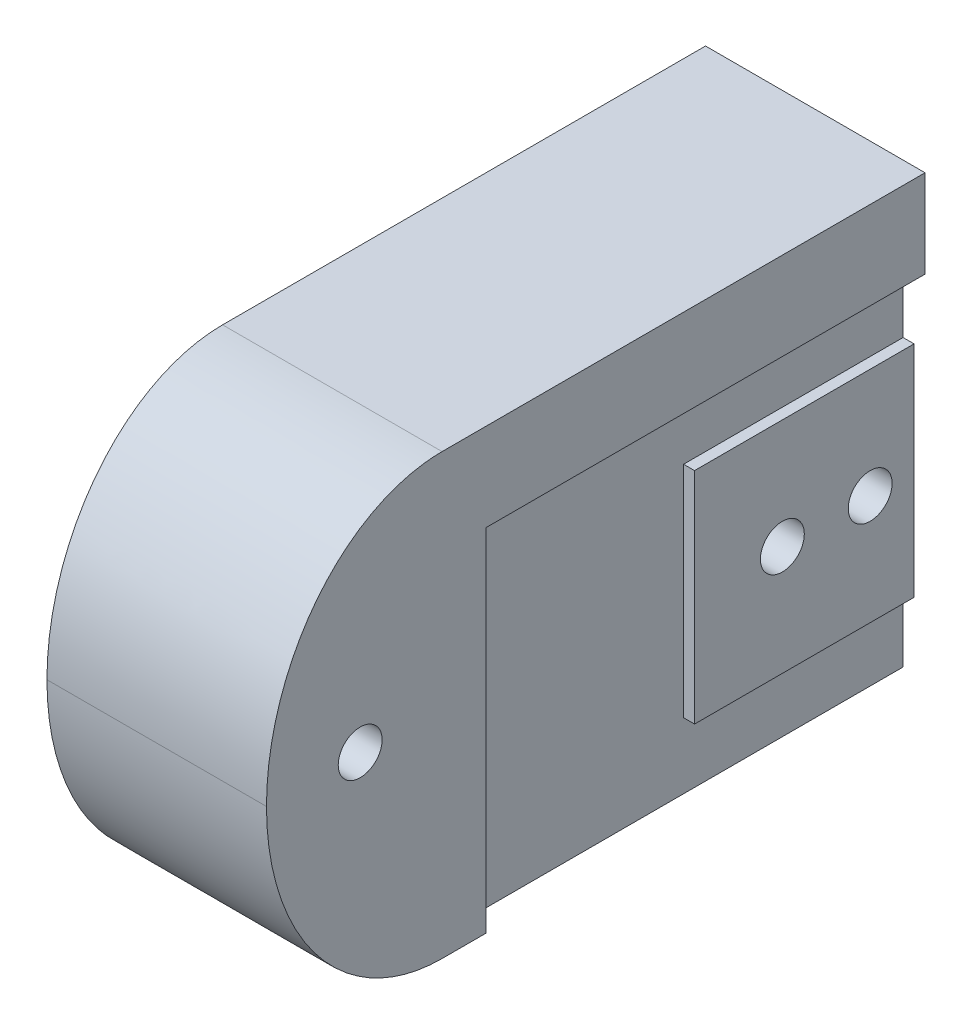
ISO-10303-21;
HEADER;
FILE_DESCRIPTION(('STEP AP214'),'2;1');
FILE_NAME('part.step','',(''),(''),'','','');
FILE_SCHEMA(('AUTOMOTIVE_DESIGN { 1 0 10303 214 1 1 1 1 }'));
ENDSEC;
DATA;
#1=APPLICATION_CONTEXT('core data for automotive mechanical design processes');
#2=APPLICATION_PROTOCOL_DEFINITION('international standard','automotive_design',2000,#1);
#3=PRODUCT_CONTEXT('',#1,'mechanical');
#4=PRODUCT('Part','Part','',(#3));
#5=PRODUCT_RELATED_PRODUCT_CATEGORY('part','',(#4));
#6=PRODUCT_DEFINITION_FORMATION('','',#4);
#7=PRODUCT_DEFINITION_CONTEXT('part definition',#1,'design');
#8=PRODUCT_DEFINITION('design','',#6,#7);
#9=PRODUCT_DEFINITION_SHAPE('','',#8);
#10=(LENGTH_UNIT() NAMED_UNIT(*) SI_UNIT(.MILLI.,.METRE.));
#11=(NAMED_UNIT(*) PLANE_ANGLE_UNIT() SI_UNIT($,.RADIAN.));
#12=(NAMED_UNIT(*) SI_UNIT($,.STERADIAN.) SOLID_ANGLE_UNIT());
#13=UNCERTAINTY_MEASURE_WITH_UNIT(LENGTH_MEASURE(1.E-05),#10,'distance_accuracy_value','');
#14=(GEOMETRIC_REPRESENTATION_CONTEXT(3) GLOBAL_UNCERTAINTY_ASSIGNED_CONTEXT((#13)) GLOBAL_UNIT_ASSIGNED_CONTEXT((#10,
#11,#12)) REPRESENTATION_CONTEXT('',''));
#15=CARTESIAN_POINT('',(0.,0.,0.));
#16=DIRECTION('',(0.,0.,1.));
#17=DIRECTION('',(1.,0.,0.));
#18=AXIS2_PLACEMENT_3D('',#15,#16,#17);
#19=CARTESIAN_POINT('',(45.,0.,0.));
#20=DIRECTION('',(1.,0.,0.));
#21=DIRECTION('',(0.,0.,-1.));
#22=AXIS2_PLACEMENT_3D('',#19,#20,#21);
#23=PLANE('',#22);
#24=DIRECTION('',(0.,-1.,0.));
#25=VECTOR('',#24,1.);
#26=CARTESIAN_POINT('',(45.,5.53697183098588,6.95422535211272));
#27=LINE('',#26,#25);
#28=CARTESIAN_POINT('',(45.,5.53697183098588,6.95422535211272));
#29=VERTEX_POINT('',#28);
#30=CARTESIAN_POINT('',(45.,-44.4630281690141,6.95422535211272));
#31=VERTEX_POINT('',#30);
#32=EDGE_CURVE('E387',#29,#31,#27,.T.);
#33=ORIENTED_EDGE('',*,*,#32,.F.);
#34=DIRECTION('',(0.,0.,1.));
#35=VECTOR('',#34,1.);
#36=CARTESIAN_POINT('',(45.,5.53697183098589,-43.0457746478873));
#37=LINE('',#36,#35);
#38=CARTESIAN_POINT('',(45.,5.53697183098589,-43.0457746478873));
#39=VERTEX_POINT('',#38);
#40=EDGE_CURVE('E390',#39,#29,#37,.T.);
#41=ORIENTED_EDGE('',*,*,#40,.F.);
#42=DIRECTION('',(0.,1.,0.));
#43=VECTOR('',#42,1.);
#44=CARTESIAN_POINT('',(45.,-59.4630281690141,-43.0457746478873));
#45=LINE('',#44,#43);
#46=CARTESIAN_POINT('',(45.,20.5369718309859,-43.0457746478873));
#47=VERTEX_POINT('',#46);
#48=EDGE_CURVE('E161',#39,#47,#45,.T.);
#49=ORIENTED_EDGE('',*,*,#48,.T.);
#50=DIRECTION('',(0.,0.,1.));
#51=VECTOR('',#50,1.);
#52=CARTESIAN_POINT('',(45.,20.5369718309859,-43.0457746478873));
#53=LINE('',#52,#51);
#54=CARTESIAN_POINT('',(45.,20.5369718309859,56.9542253521127));
#55=VERTEX_POINT('',#54);
#56=EDGE_CURVE('E174',#47,#55,#53,.T.);
#57=ORIENTED_EDGE('',*,*,#56,.T.);
#58=DIRECTION('',(0.,-1.,0.));
#59=VECTOR('',#58,1.);
#60=CARTESIAN_POINT('',(45.,-59.4630281690141,56.9542253521127));
#61=LINE('',#60,#59);
#62=CARTESIAN_POINT('',(45.,-59.4630281690141,56.9542253521127));
#63=VERTEX_POINT('',#62);
#64=EDGE_CURVE('E177',#55,#63,#61,.T.);
#65=ORIENTED_EDGE('',*,*,#64,.T.);
#66=DIRECTION('',(0.,0.,-1.));
#67=VECTOR('',#66,1.);
#68=CARTESIAN_POINT('',(45.,-59.4630281690141,-43.0457746478873));
#69=LINE('',#68,#67);
#70=CARTESIAN_POINT('',(45.,-59.4630281690141,-43.0457746478873));
#71=VERTEX_POINT('',#70);
#72=EDGE_CURVE('E180',#63,#71,#69,.T.);
#73=ORIENTED_EDGE('',*,*,#72,.T.);
#74=CARTESIAN_POINT('',(45.,-44.4630281690141,-43.0457746478873));
#75=VERTEX_POINT('',#74);
#76=EDGE_CURVE('E171',#71,#75,#45,.T.);
#77=ORIENTED_EDGE('',*,*,#76,.T.);
#78=DIRECTION('',(0.,0.,-1.));
#79=VECTOR('',#78,1.);
#80=CARTESIAN_POINT('',(45.,-44.4630281690141,-43.0457746478873));
#81=LINE('',#80,#79);
#82=EDGE_CURVE('E155',#31,#75,#81,.T.);
#83=ORIENTED_EDGE('',*,*,#82,.F.);
#84=EDGE_LOOP('',(#33,#41,#49,#57,#65,#73,#77,#83));
#85=FACE_BOUND('',#84,.T.);
#86=ADVANCED_FACE('F39',(#85),#23,.T.);
#87=CARTESIAN_POINT('',(50.,-59.4630281690141,106.954225352113));
#88=DIRECTION('',(0.,1.,0.));
#89=DIRECTION('',(0.,0.,1.));
#90=AXIS2_PLACEMENT_3D('',#87,#88,#89);
#91=PLANE('',#90);
#92=DIRECTION('',(0.,0.,-1.));
#93=VECTOR('',#92,1.);
#94=CARTESIAN_POINT('',(50.,-59.4630281690141,106.954225352113));
#95=LINE('',#94,#93);
#96=CARTESIAN_POINT('',(50.,-59.4630281690141,66.9542253521127));
#97=VERTEX_POINT('',#96);
#98=CARTESIAN_POINT('',(50.,-59.4630281690141,56.9542253521127));
#99=VERTEX_POINT('',#98);
#100=EDGE_CURVE('E197',#97,#99,#95,.T.);
#101=ORIENTED_EDGE('',*,*,#100,.F.);
#102=CARTESIAN_POINT('',(-2.5,-59.4630281690141,66.9542253521127));
#103=CARTESIAN_POINT('',(15.8333333333333,-59.4630281690141,66.9542253521127));
#104=CARTESIAN_POINT('',(34.1666666666667,-59.4630281690141,66.9542253521127));
#105=CARTESIAN_POINT('',(52.5,-59.4630281690141,66.9542253521127));
#106=(BOUNDED_CURVE() B_SPLINE_CURVE(3,(#102,#103,#104,#105),.UNSPECIFIED.,.F.,
.F.) B_SPLINE_CURVE_WITH_KNOTS((4,4),(-0.0025,0.0525),
.UNSPECIFIED.) CURVE() GEOMETRIC_REPRESENTATION_ITEM() RATIONAL_B_SPLINE_CURVE((1.,1.,1.,1.)) REPRESENTATION_ITEM(''));
#107=CARTESIAN_POINT('',(0.,-59.4630281690141,66.9542253521127));
#108=VERTEX_POINT('',#107);
#109=EDGE_CURVE('E367',#97,#108,#106,.F.);
#110=ORIENTED_EDGE('',*,*,#109,.T.);
#111=DIRECTION('',(0.,0.,-1.));
#112=VECTOR('',#111,1.);
#113=CARTESIAN_POINT('',(0.,-59.4630281690141,106.954225352113));
#114=LINE('',#113,#112);
#115=CARTESIAN_POINT('',(0.,-59.4630281690141,-43.0457746478873));
#116=VERTEX_POINT('',#115);
#117=EDGE_CURVE('E188',#108,#116,#114,.T.);
#118=ORIENTED_EDGE('',*,*,#117,.T.);
#119=DIRECTION('',(-1.,0.,0.));
#120=VECTOR('',#119,1.);
#121=CARTESIAN_POINT('',(50.,-59.4630281690141,-43.0457746478873));
#122=LINE('',#121,#120);
#123=EDGE_CURVE('E201',#71,#116,#122,.T.);
#124=ORIENTED_EDGE('',*,*,#123,.F.);
#125=ORIENTED_EDGE('',*,*,#72,.F.);
#126=DIRECTION('',(1.,0.,0.));
#127=VECTOR('',#126,1.);
#128=CARTESIAN_POINT('',(45.,-59.4630281690141,56.9542253521127));
#129=LINE('',#128,#127);
#130=EDGE_CURVE('E185',#63,#99,#129,.T.);
#131=ORIENTED_EDGE('',*,*,#130,.T.);
#132=EDGE_LOOP('',(#101,#110,#118,#124,#125,#131));
#133=FACE_BOUND('',#132,.T.);
#134=ADVANCED_FACE('F308',(#133),#91,.F.);
#135=CARTESIAN_POINT('',(50.,40.5369718309859,-43.0457746478873));
#136=DIRECTION('',(0.,0.,1.));
#137=DIRECTION('',(0.,-1.,0.));
#138=AXIS2_PLACEMENT_3D('',#135,#136,#137);
#139=PLANE('',#138);
#140=DIRECTION('',(0.,1.,0.));
#141=VECTOR('',#140,1.);
#142=CARTESIAN_POINT('',(50.,40.5369718309859,-43.0457746478873));
#143=LINE('',#142,#141);
#144=CARTESIAN_POINT('',(50.,20.5369718309859,-43.0457746478873));
#145=VERTEX_POINT('',#144);
#146=CARTESIAN_POINT('',(50.,40.5369718309859,-43.0457746478873));
#147=VERTEX_POINT('',#146);
#148=EDGE_CURVE('E194',#145,#147,#143,.T.);
#149=ORIENTED_EDGE('',*,*,#148,.F.);
#150=DIRECTION('',(1.,0.,0.));
#151=VECTOR('',#150,1.);
#152=CARTESIAN_POINT('',(45.,20.5369718309859,-43.0457746478873));
#153=LINE('',#152,#151);
#154=EDGE_CURVE('E181',#47,#145,#153,.T.);
#155=ORIENTED_EDGE('',*,*,#154,.F.);
#156=ORIENTED_EDGE('',*,*,#48,.F.);
#157=DIRECTION('',(-1.,0.,0.));
#158=VECTOR('',#157,1.);
#159=CARTESIAN_POINT('',(47.5,5.53697183098589,-43.0457746478873));
#160=LINE('',#159,#158);
#161=CARTESIAN_POINT('',(47.5,5.53697183098589,-43.0457746478873));
#162=VERTEX_POINT('',#161);
#163=EDGE_CURVE('E139',#162,#39,#160,.T.);
#164=ORIENTED_EDGE('',*,*,#163,.F.);
#165=DIRECTION('',(0.,1.,0.));
#166=VECTOR('',#165,1.);
#167=CARTESIAN_POINT('',(47.5,5.53697183098589,-43.0457746478873));
#168=LINE('',#167,#166);
#169=CARTESIAN_POINT('',(47.5,-44.4630281690141,-43.0457746478873));
#170=VERTEX_POINT('',#169);
#171=EDGE_CURVE('E146',#170,#162,#168,.T.);
#172=ORIENTED_EDGE('',*,*,#171,.F.);
#173=DIRECTION('',(-1.,0.,0.));
#174=VECTOR('',#173,1.);
#175=CARTESIAN_POINT('',(47.5,-44.4630281690141,-43.0457746478873));
#176=LINE('',#175,#174);
#177=EDGE_CURVE('E381',#170,#75,#176,.T.);
#178=ORIENTED_EDGE('',*,*,#177,.T.);
#179=ORIENTED_EDGE('',*,*,#76,.F.);
#180=ORIENTED_EDGE('',*,*,#123,.T.);
#181=DIRECTION('',(0.,1.,0.));
#182=VECTOR('',#181,1.);
#183=CARTESIAN_POINT('',(0.,40.5369718309859,-43.0457746478873));
#184=LINE('',#183,#182);
#185=CARTESIAN_POINT('',(0.,40.5369718309859,-43.0457746478873));
#186=VERTEX_POINT('',#185);
#187=EDGE_CURVE('E205',#116,#186,#184,.T.);
#188=ORIENTED_EDGE('',*,*,#187,.T.);
#189=DIRECTION('',(-1.,0.,0.));
#190=VECTOR('',#189,1.);
#191=CARTESIAN_POINT('',(50.,40.5369718309859,-43.0457746478873));
#192=LINE('',#191,#190);
#193=EDGE_CURVE('E213',#147,#186,#192,.T.);
#194=ORIENTED_EDGE('',*,*,#193,.F.);
#195=EDGE_LOOP('',(#149,#155,#156,#164,#172,#178,#179,#180,#188,#194));
#196=FACE_BOUND('',#195,.T.);
#197=ADVANCED_FACE('F159',(#196),#139,.F.);
#198=CARTESIAN_POINT('',(50.,40.5369718309859,106.954225352113));
#199=DIRECTION('',(0.,-1.,0.));
#200=DIRECTION('',(0.,0.,-1.));
#201=AXIS2_PLACEMENT_3D('',#198,#199,#200);
#202=PLANE('',#201);
#203=DIRECTION('',(0.,0.,1.));
#204=VECTOR('',#203,1.);
#205=CARTESIAN_POINT('',(0.,40.5369718309859,106.954225352113));
#206=LINE('',#205,#204);
#207=CARTESIAN_POINT('',(0.,40.5369718309859,66.9542253521127));
#208=VERTEX_POINT('',#207);
#209=EDGE_CURVE('E200',#186,#208,#206,.T.);
#210=ORIENTED_EDGE('',*,*,#209,.T.);
#211=CARTESIAN_POINT('',(52.5,40.5369718309859,66.9542253521127));
#212=CARTESIAN_POINT('',(34.1666666666667,40.5369718309859,66.9542253521127));
#213=CARTESIAN_POINT('',(15.8333333333333,40.5369718309859,66.9542253521127));
#214=CARTESIAN_POINT('',(-2.5,40.5369718309859,66.9542253521127));
#215=(BOUNDED_CURVE() B_SPLINE_CURVE(3,(#211,#212,#213,#214),.UNSPECIFIED.,.F.,
.F.) B_SPLINE_CURVE_WITH_KNOTS((4,4),(-0.0025,0.0525),
.UNSPECIFIED.) CURVE() GEOMETRIC_REPRESENTATION_ITEM() RATIONAL_B_SPLINE_CURVE((1.,1.,1.,1.)) REPRESENTATION_ITEM(''));
#216=CARTESIAN_POINT('',(50.,40.5369718309859,66.9542253521127));
#217=VERTEX_POINT('',#216);
#218=EDGE_CURVE('E12',#208,#217,#215,.F.);
#219=ORIENTED_EDGE('',*,*,#218,.T.);
#220=DIRECTION('',(0.,0.,1.));
#221=VECTOR('',#220,1.);
#222=CARTESIAN_POINT('',(50.,40.5369718309859,106.954225352113));
#223=LINE('',#222,#221);
#224=EDGE_CURVE('E251',#147,#217,#223,.T.);
#225=ORIENTED_EDGE('',*,*,#224,.F.);
#226=ORIENTED_EDGE('',*,*,#193,.T.);
#227=EDGE_LOOP('',(#210,#219,#225,#226));
#228=FACE_BOUND('',#227,.T.);
#229=ADVANCED_FACE('F244',(#228),#202,.F.);
#230=CARTESIAN_POINT('',(50.,0.,0.));
#231=DIRECTION('',(1.,0.,0.));
#232=DIRECTION('',(0.,0.,-1.));
#233=AXIS2_PLACEMENT_3D('',#230,#231,#232);
#234=PLANE('',#233);
#235=CARTESIAN_POINT('',(50.,-9.4630281690141,85.6147511313994));
#236=DIRECTION('',(1.,0.,0.));
#237=DIRECTION('',(0.,0.,-1.));
#238=AXIS2_PLACEMENT_3D('',#235,#236,#237);
#239=CIRCLE('',#238,5.);
#240=CARTESIAN_POINT('',(50.,-9.4630281690141,80.6147511313994));
#241=VERTEX_POINT('',#240);
#242=EDGE_CURVE('E405',#241,#241,#239,.T.);
#243=ORIENTED_EDGE('',*,*,#242,.F.);
#244=EDGE_LOOP('',(#243));
#245=FACE_BOUND('',#244,.T.);
#246=CARTESIAN_POINT('',(50.,-9.4630281690141,106.954225352113));
#247=CARTESIAN_POINT('',(50.,40.5369718309859,106.954225352113));
#248=CARTESIAN_POINT('',(50.,40.5369718309859,66.9542253521127));
#249=(BOUNDED_CURVE() B_SPLINE_CURVE(2,(#246,#247,#248),.UNSPECIFIED.,.F.,
.F.) B_SPLINE_CURVE_WITH_KNOTS((3,3),(0.,1.),
.UNSPECIFIED.) CURVE() GEOMETRIC_REPRESENTATION_ITEM() RATIONAL_B_SPLINE_CURVE((1.,
0.707106781186547,1.)) REPRESENTATION_ITEM(''));
#250=CARTESIAN_POINT('',(50.,-9.4630281690141,106.954225352113));
#251=VERTEX_POINT('',#250);
#252=EDGE_CURVE('E60',#217,#251,#249,.F.);
#253=ORIENTED_EDGE('',*,*,#252,.T.);
#254=CARTESIAN_POINT('',(50.,-59.4630281690141,66.9542253521127));
#255=CARTESIAN_POINT('',(50.,-59.4630281690141,106.954225352113));
#256=CARTESIAN_POINT('',(50.,-9.4630281690141,106.954225352113));
#257=(BOUNDED_CURVE() B_SPLINE_CURVE(2,(#254,#255,#256),.UNSPECIFIED.,.F.,
.F.) B_SPLINE_CURVE_WITH_KNOTS((3,3),(0.,1.),
.UNSPECIFIED.) CURVE() GEOMETRIC_REPRESENTATION_ITEM() RATIONAL_B_SPLINE_CURVE((1.,
0.707106781186548,1.)) REPRESENTATION_ITEM(''));
#258=EDGE_CURVE('E53',#251,#97,#257,.F.);
#259=ORIENTED_EDGE('',*,*,#258,.T.);
#260=ORIENTED_EDGE('',*,*,#100,.T.);
#261=DIRECTION('',(0.,-1.,0.));
#262=VECTOR('',#261,1.);
#263=CARTESIAN_POINT('',(50.,-59.4630281690141,56.9542253521127));
#264=LINE('',#263,#262);
#265=CARTESIAN_POINT('',(50.,20.5369718309859,56.9542253521127));
#266=VERTEX_POINT('',#265);
#267=EDGE_CURVE('E165',#266,#99,#264,.T.);
#268=ORIENTED_EDGE('',*,*,#267,.F.);
#269=DIRECTION('',(0.,0.,1.));
#270=VECTOR('',#269,1.);
#271=CARTESIAN_POINT('',(50.,20.5369718309859,-43.0457746478873));
#272=LINE('',#271,#270);
#273=EDGE_CURVE('E162',#145,#266,#272,.T.);
#274=ORIENTED_EDGE('',*,*,#273,.F.);
#275=ORIENTED_EDGE('',*,*,#148,.T.);
#276=ORIENTED_EDGE('',*,*,#224,.T.);
#277=EDGE_LOOP('',(#253,#259,#260,#268,#274,#275,#276));
#278=FACE_BOUND('',#277,.T.);
#279=ADVANCED_FACE('F240',(#245,#278),#234,.T.);
#280=CARTESIAN_POINT('',(0.,0.,0.));
#281=DIRECTION('',(1.,0.,0.));
#282=DIRECTION('',(0.,0.,-1.));
#283=AXIS2_PLACEMENT_3D('',#280,#281,#282);
#284=PLANE('',#283);
#285=CARTESIAN_POINT('',(0.,-9.4630281690141,85.6147511313994));
#286=DIRECTION('',(-1.,0.,0.));
#287=DIRECTION('',(0.,0.,1.));
#288=AXIS2_PLACEMENT_3D('',#285,#286,#287);
#289=CIRCLE('',#288,5.);
#290=CARTESIAN_POINT('',(0.,-9.4630281690141,90.6147511313994));
#291=VERTEX_POINT('',#290);
#292=EDGE_CURVE('E408',#291,#291,#289,.T.);
#293=ORIENTED_EDGE('',*,*,#292,.F.);
#294=EDGE_LOOP('',(#293));
#295=FACE_BOUND('',#294,.T.);
#296=ORIENTED_EDGE('',*,*,#117,.F.);
#297=CARTESIAN_POINT('',(0.,-9.4630281690141,106.954225352113));
#298=CARTESIAN_POINT('',(0.,-59.4630281690141,106.954225352113));
#299=CARTESIAN_POINT('',(0.,-59.4630281690141,66.9542253521127));
#300=(BOUNDED_CURVE() B_SPLINE_CURVE(2,(#297,#298,#299),.UNSPECIFIED.,.F.,
.F.) B_SPLINE_CURVE_WITH_KNOTS((3,3),(0.,1.),
.UNSPECIFIED.) CURVE() GEOMETRIC_REPRESENTATION_ITEM() RATIONAL_B_SPLINE_CURVE((1.,
0.707106781186548,1.)) REPRESENTATION_ITEM(''));
#301=CARTESIAN_POINT('',(0.,-9.4630281690141,106.954225352113));
#302=VERTEX_POINT('',#301);
#303=EDGE_CURVE('E289',#108,#302,#300,.F.);
#304=ORIENTED_EDGE('',*,*,#303,.T.);
#305=CARTESIAN_POINT('',(0.,40.5369718309859,66.9542253521127));
#306=CARTESIAN_POINT('',(0.,40.5369718309859,106.954225352113));
#307=CARTESIAN_POINT('',(0.,-9.4630281690141,106.954225352113));
#308=(BOUNDED_CURVE() B_SPLINE_CURVE(2,(#305,#306,#307),.UNSPECIFIED.,.F.,
.F.) B_SPLINE_CURVE_WITH_KNOTS((3,3),(0.,1.),
.UNSPECIFIED.) CURVE() GEOMETRIC_REPRESENTATION_ITEM() RATIONAL_B_SPLINE_CURVE((1.,
0.707106781186548,1.)) REPRESENTATION_ITEM(''));
#309=EDGE_CURVE('E223',#302,#208,#308,.F.);
#310=ORIENTED_EDGE('',*,*,#309,.T.);
#311=ORIENTED_EDGE('',*,*,#209,.F.);
#312=ORIENTED_EDGE('',*,*,#187,.F.);
#313=EDGE_LOOP('',(#296,#304,#310,#311,#312));
#314=FACE_BOUND('',#313,.T.);
#315=ADVANCED_FACE('F229',(#295,#314),#284,.F.);
#316=CARTESIAN_POINT('',(45.,-59.4630281690141,56.9542253521127));
#317=DIRECTION('',(0.,0.,1.));
#318=DIRECTION('',(1.,0.,0.));
#319=AXIS2_PLACEMENT_3D('',#316,#317,#318);
#320=PLANE('',#319);
#321=ORIENTED_EDGE('',*,*,#267,.T.);
#322=ORIENTED_EDGE('',*,*,#130,.F.);
#323=ORIENTED_EDGE('',*,*,#64,.F.);
#324=DIRECTION('',(1.,0.,0.));
#325=VECTOR('',#324,1.);
#326=CARTESIAN_POINT('',(45.,20.5369718309859,56.9542253521127));
#327=LINE('',#326,#325);
#328=EDGE_CURVE('E189',#55,#266,#327,.T.);
#329=ORIENTED_EDGE('',*,*,#328,.T.);
#330=EDGE_LOOP('',(#321,#322,#323,#329));
#331=FACE_BOUND('',#330,.T.);
#332=ADVANCED_FACE('F239',(#331),#320,.F.);
#333=CARTESIAN_POINT('',(45.,20.5369718309859,-43.0457746478873));
#334=DIRECTION('',(0.,1.,0.));
#335=DIRECTION('',(0.,0.,1.));
#336=AXIS2_PLACEMENT_3D('',#333,#334,#335);
#337=PLANE('',#336);
#338=ORIENTED_EDGE('',*,*,#273,.T.);
#339=ORIENTED_EDGE('',*,*,#328,.F.);
#340=ORIENTED_EDGE('',*,*,#56,.F.);
#341=ORIENTED_EDGE('',*,*,#154,.T.);
#342=EDGE_LOOP('',(#338,#339,#340,#341));
#343=FACE_BOUND('',#342,.T.);
#344=ADVANCED_FACE('F427',(#343),#337,.F.);
#345=CARTESIAN_POINT('',(47.5,5.53697183098589,-43.0457746478873));
#346=DIRECTION('',(0.,-1.,0.));
#347=DIRECTION('',(0.,0.,-1.));
#348=AXIS2_PLACEMENT_3D('',#345,#346,#347);
#349=PLANE('',#348);
#350=ORIENTED_EDGE('',*,*,#40,.T.);
#351=DIRECTION('',(-1.,0.,0.));
#352=VECTOR('',#351,1.);
#353=CARTESIAN_POINT('',(47.5,5.53697183098588,6.95422535211272));
#354=LINE('',#353,#352);
#355=CARTESIAN_POINT('',(47.5,5.53697183098588,6.95422535211272));
#356=VERTEX_POINT('',#355);
#357=EDGE_CURVE('E142',#356,#29,#354,.T.);
#358=ORIENTED_EDGE('',*,*,#357,.F.);
#359=DIRECTION('',(0.,0.,1.));
#360=VECTOR('',#359,1.);
#361=CARTESIAN_POINT('',(47.5,5.53697183098589,-43.0457746478873));
#362=LINE('',#361,#360);
#363=EDGE_CURVE('E135',#162,#356,#362,.T.);
#364=ORIENTED_EDGE('',*,*,#363,.F.);
#365=ORIENTED_EDGE('',*,*,#163,.T.);
#366=EDGE_LOOP('',(#350,#358,#364,#365));
#367=FACE_BOUND('',#366,.T.);
#368=ADVANCED_FACE('F137',(#367),#349,.F.);
#369=CARTESIAN_POINT('',(47.5,5.53697183098588,6.95422535211272));
#370=DIRECTION('',(0.,0.,-1.));
#371=DIRECTION('',(0.,1.,0.));
#372=AXIS2_PLACEMENT_3D('',#369,#370,#371);
#373=PLANE('',#372);
#374=ORIENTED_EDGE('',*,*,#32,.T.);
#375=DIRECTION('',(-1.,0.,0.));
#376=VECTOR('',#375,1.);
#377=CARTESIAN_POINT('',(47.5,-44.4630281690141,6.95422535211272));
#378=LINE('',#377,#376);
#379=CARTESIAN_POINT('',(47.5,-44.4630281690141,6.95422535211272));
#380=VERTEX_POINT('',#379);
#381=EDGE_CURVE('E167',#380,#31,#378,.T.);
#382=ORIENTED_EDGE('',*,*,#381,.F.);
#383=DIRECTION('',(0.,-1.,0.));
#384=VECTOR('',#383,1.);
#385=CARTESIAN_POINT('',(47.5,5.53697183098588,6.95422535211272));
#386=LINE('',#385,#384);
#387=EDGE_CURVE('E145',#356,#380,#386,.T.);
#388=ORIENTED_EDGE('',*,*,#387,.F.);
#389=ORIENTED_EDGE('',*,*,#357,.T.);
#390=EDGE_LOOP('',(#374,#382,#388,#389));
#391=FACE_BOUND('',#390,.T.);
#392=ADVANCED_FACE('F434',(#391),#373,.F.);
#393=CARTESIAN_POINT('',(47.5,-44.4630281690141,-43.0457746478873));
#394=DIRECTION('',(0.,1.,0.));
#395=DIRECTION('',(0.,0.,1.));
#396=AXIS2_PLACEMENT_3D('',#393,#394,#395);
#397=PLANE('',#396);
#398=ORIENTED_EDGE('',*,*,#82,.T.);
#399=ORIENTED_EDGE('',*,*,#177,.F.);
#400=DIRECTION('',(0.,0.,-1.));
#401=VECTOR('',#400,1.);
#402=CARTESIAN_POINT('',(47.5,-44.4630281690141,-43.0457746478873));
#403=LINE('',#402,#401);
#404=EDGE_CURVE('E151',#380,#170,#403,.T.);
#405=ORIENTED_EDGE('',*,*,#404,.F.);
#406=ORIENTED_EDGE('',*,*,#381,.T.);
#407=EDGE_LOOP('',(#398,#399,#405,#406));
#408=FACE_BOUND('',#407,.T.);
#409=ADVANCED_FACE('F440',(#408),#397,.F.);
#410=CARTESIAN_POINT('',(47.5,0.,0.));
#411=DIRECTION('',(-1.,0.,0.));
#412=DIRECTION('',(0.,0.,1.));
#413=AXIS2_PLACEMENT_3D('',#410,#411,#412);
#414=PLANE('',#413);
#415=CARTESIAN_POINT('',(47.5,-19.4630281690141,-33.0457746478873));
#416=DIRECTION('',(1.,0.,0.));
#417=DIRECTION('',(0.,0.,-1.));
#418=AXIS2_PLACEMENT_3D('',#415,#416,#417);
#419=CIRCLE('',#418,5.);
#420=CARTESIAN_POINT('',(47.5,-19.4630281690141,-38.0457746478873));
#421=VERTEX_POINT('',#420);
#422=EDGE_CURVE('E400',#421,#421,#419,.T.);
#423=ORIENTED_EDGE('',*,*,#422,.F.);
#424=EDGE_LOOP('',(#423));
#425=FACE_BOUND('',#424,.T.);
#426=CARTESIAN_POINT('',(47.5,-19.4630281690141,-13.0457746478873));
#427=DIRECTION('',(1.,0.,0.));
#428=DIRECTION('',(0.,0.,-1.));
#429=AXIS2_PLACEMENT_3D('',#426,#427,#428);
#430=CIRCLE('',#429,5.);
#431=CARTESIAN_POINT('',(47.5,-19.4630281690141,-18.0457746478873));
#432=VERTEX_POINT('',#431);
#433=EDGE_CURVE('E394',#432,#432,#430,.T.);
#434=ORIENTED_EDGE('',*,*,#433,.F.);
#435=EDGE_LOOP('',(#434));
#436=FACE_BOUND('',#435,.T.);
#437=ORIENTED_EDGE('',*,*,#171,.T.);
#438=ORIENTED_EDGE('',*,*,#363,.T.);
#439=ORIENTED_EDGE('',*,*,#387,.T.);
#440=ORIENTED_EDGE('',*,*,#404,.T.);
#441=EDGE_LOOP('',(#437,#438,#439,#440));
#442=FACE_BOUND('',#441,.T.);
#443=ADVANCED_FACE('F149',(#425,#436,#442),#414,.F.);
#444=CARTESIAN_POINT('',(37.5,-19.4630281690141,-13.0457746478873));
#445=DIRECTION('',(1.,0.,0.));
#446=DIRECTION('',(0.,0.,-1.));
#447=AXIS2_PLACEMENT_3D('',#444,#445,#446);
#448=CYLINDRICAL_SURFACE('',#447,5.);
#449=CARTESIAN_POINT('',(37.5,-19.4630281690141,-13.0457746478873));
#450=DIRECTION('',(1.,0.,0.));
#451=DIRECTION('',(0.,0.,-1.));
#452=AXIS2_PLACEMENT_3D('',#449,#450,#451);
#453=CIRCLE('',#452,5.);
#454=CARTESIAN_POINT('',(37.5,-19.4630281690141,-18.0457746478873));
#455=VERTEX_POINT('',#454);
#456=EDGE_CURVE('E397',#455,#455,#453,.T.);
#457=ORIENTED_EDGE('',*,*,#456,.F.);
#458=EDGE_LOOP('',(#457));
#459=FACE_BOUND('',#458,.T.);
#460=ORIENTED_EDGE('',*,*,#433,.T.);
#461=EDGE_LOOP('',(#460));
#462=FACE_BOUND('',#461,.T.);
#463=ADVANCED_FACE('F447',(#459,#462),#448,.F.);
#464=CARTESIAN_POINT('',(37.5,-19.4630281690141,-13.0457746478873));
#465=DIRECTION('',(1.,0.,0.));
#466=DIRECTION('',(0.,0.,-1.));
#467=AXIS2_PLACEMENT_3D('',#464,#465,#466);
#468=PLANE('',#467);
#469=ORIENTED_EDGE('',*,*,#456,.T.);
#470=EDGE_LOOP('',(#469));
#471=FACE_BOUND('',#470,.T.);
#472=ADVANCED_FACE('F453',(#471),#468,.T.);
#473=CARTESIAN_POINT('',(37.5,-19.4630281690141,-33.0457746478873));
#474=DIRECTION('',(1.,0.,0.));
#475=DIRECTION('',(0.,0.,-1.));
#476=AXIS2_PLACEMENT_3D('',#473,#474,#475);
#477=CYLINDRICAL_SURFACE('',#476,5.);
#478=CARTESIAN_POINT('',(37.5,-19.4630281690141,-33.0457746478873));
#479=DIRECTION('',(1.,0.,0.));
#480=DIRECTION('',(0.,0.,-1.));
#481=AXIS2_PLACEMENT_3D('',#478,#479,#480);
#482=CIRCLE('',#481,5.);
#483=CARTESIAN_POINT('',(37.5,-19.4630281690141,-38.0457746478873));
#484=VERTEX_POINT('',#483);
#485=EDGE_CURVE('E391',#484,#484,#482,.T.);
#486=ORIENTED_EDGE('',*,*,#485,.F.);
#487=EDGE_LOOP('',(#486));
#488=FACE_BOUND('',#487,.T.);
#489=ORIENTED_EDGE('',*,*,#422,.T.);
#490=EDGE_LOOP('',(#489));
#491=FACE_BOUND('',#490,.T.);
#492=ADVANCED_FACE('F457',(#488,#491),#477,.F.);
#493=CARTESIAN_POINT('',(37.5,-19.4630281690141,-33.0457746478873));
#494=DIRECTION('',(1.,0.,0.));
#495=DIRECTION('',(0.,0.,-1.));
#496=AXIS2_PLACEMENT_3D('',#493,#494,#495);
#497=PLANE('',#496);
#498=ORIENTED_EDGE('',*,*,#485,.T.);
#499=EDGE_LOOP('',(#498));
#500=FACE_BOUND('',#499,.T.);
#501=ADVANCED_FACE('F460',(#500),#497,.T.);
#502=CARTESIAN_POINT('',(52.5,-9.4630281690141,106.954225352113));
#503=CARTESIAN_POINT('',(34.1666666666667,-9.4630281690141,106.954225352113));
#504=CARTESIAN_POINT('',(15.8333333333333,-9.4630281690141,106.954225352113));
#505=CARTESIAN_POINT('',(-2.5,-9.4630281690141,106.954225352113));
#506=CARTESIAN_POINT('',(52.5,40.5369718309859,106.954225352113));
#507=CARTESIAN_POINT('',(34.1666666666667,40.5369718309859,106.954225352113));
#508=CARTESIAN_POINT('',(15.8333333333333,40.5369718309859,106.954225352113));
#509=CARTESIAN_POINT('',(-2.5,40.5369718309859,106.954225352113));
#510=CARTESIAN_POINT('',(52.5,40.5369718309859,66.9542253521127));
#511=CARTESIAN_POINT('',(34.1666666666667,40.5369718309859,66.9542253521127));
#512=CARTESIAN_POINT('',(15.8333333333333,40.5369718309859,66.9542253521127));
#513=CARTESIAN_POINT('',(-2.5,40.5369718309859,66.9542253521127));
#514=(BOUNDED_SURFACE() B_SPLINE_SURFACE(2,3,((#502,#503,#504,#505),(#506,#507,#508,#509),(#510,
#511,#512,#513)),.UNSPECIFIED.,.F.,.F.,.F.) B_SPLINE_SURFACE_WITH_KNOTS((3,3),(4,4),(0.,1.),
(-0.0025,0.0525),.UNSPECIFIED.) GEOMETRIC_REPRESENTATION_ITEM() RATIONAL_B_SPLINE_SURFACE(((1.,
1.,1.,1.),(0.707106781186548,0.707106781186548,0.707106781186548,0.707106781186548),(1.,1.,1.,1.))) REPRESENTATION_ITEM('') SURFACE());
#515=CARTESIAN_POINT('',(52.5,-9.4630281690141,106.954225352113));
#516=CARTESIAN_POINT('',(34.1666666666667,-9.4630281690141,106.954225352113));
#517=CARTESIAN_POINT('',(15.8333333333333,-9.4630281690141,106.954225352113));
#518=CARTESIAN_POINT('',(-2.5,-9.4630281690141,106.954225352113));
#519=(BOUNDED_CURVE() B_SPLINE_CURVE(3,(#515,#516,#517,#518),.UNSPECIFIED.,.F.,
.F.) B_SPLINE_CURVE_WITH_KNOTS((4,4),(-0.0025,0.0525),
.UNSPECIFIED.) CURVE() GEOMETRIC_REPRESENTATION_ITEM() RATIONAL_B_SPLINE_CURVE((1.,1.,1.,1.)) REPRESENTATION_ITEM(''));
#520=EDGE_CURVE('E331',#251,#302,#519,.T.);
#521=ORIENTED_EDGE('',*,*,#520,.F.);
#522=ORIENTED_EDGE('',*,*,#252,.F.);
#523=ORIENTED_EDGE('',*,*,#218,.F.);
#524=ORIENTED_EDGE('',*,*,#309,.F.);
#525=EDGE_LOOP('',(#521,#522,#523,#524));
#526=FACE_BOUND('',#525,.T.);
#527=ADVANCED_FACE('F42',(#526),#514,.T.);
#528=CARTESIAN_POINT('',(52.5,-59.4630281690141,66.9542253521127));
#529=CARTESIAN_POINT('',(34.1666666666667,-59.4630281690141,66.9542253521127));
#530=CARTESIAN_POINT('',(15.8333333333333,-59.4630281690141,66.9542253521127));
#531=CARTESIAN_POINT('',(-2.5,-59.4630281690141,66.9542253521127));
#532=CARTESIAN_POINT('',(52.5,-59.4630281690141,106.954225352113));
#533=CARTESIAN_POINT('',(34.1666666666667,-59.4630281690141,106.954225352113));
#534=CARTESIAN_POINT('',(15.8333333333333,-59.4630281690141,106.954225352113));
#535=CARTESIAN_POINT('',(-2.5,-59.4630281690141,106.954225352113));
#536=CARTESIAN_POINT('',(52.5,-9.4630281690141,106.954225352113));
#537=CARTESIAN_POINT('',(34.1666666666667,-9.4630281690141,106.954225352113));
#538=CARTESIAN_POINT('',(15.8333333333333,-9.4630281690141,106.954225352113));
#539=CARTESIAN_POINT('',(-2.5,-9.4630281690141,106.954225352113));
#540=(BOUNDED_SURFACE() B_SPLINE_SURFACE(2,3,((#528,#529,#530,#531),(#532,#533,#534,#535),(#536,
#537,#538,#539)),.UNSPECIFIED.,.F.,.F.,.F.) B_SPLINE_SURFACE_WITH_KNOTS((3,3),(4,4),(0.,1.),
(-0.0025,0.0525),.UNSPECIFIED.) GEOMETRIC_REPRESENTATION_ITEM() RATIONAL_B_SPLINE_SURFACE(((1.,
1.,1.,1.),(0.707106781186548,0.707106781186548,0.707106781186548,0.707106781186548),(1.,1.,1.,1.))) REPRESENTATION_ITEM('') SURFACE());
#541=ORIENTED_EDGE('',*,*,#258,.F.);
#542=ORIENTED_EDGE('',*,*,#520,.T.);
#543=ORIENTED_EDGE('',*,*,#303,.F.);
#544=ORIENTED_EDGE('',*,*,#109,.F.);
#545=EDGE_LOOP('',(#541,#542,#543,#544));
#546=FACE_BOUND('',#545,.T.);
#547=ADVANCED_FACE('F295',(#546),#540,.T.);
#548=CARTESIAN_POINT('',(380.,-9.4630281690141,85.6147511313994));
#549=DIRECTION('',(-1.,0.,0.));
#550=DIRECTION('',(0.,0.,1.));
#551=AXIS2_PLACEMENT_3D('',#548,#549,#550);
#552=CYLINDRICAL_SURFACE('',#551,5.);
#553=ORIENTED_EDGE('',*,*,#242,.T.);
#554=EDGE_LOOP('',(#553));
#555=FACE_BOUND('',#554,.T.);
#556=ORIENTED_EDGE('',*,*,#292,.T.);
#557=EDGE_LOOP('',(#556));
#558=FACE_BOUND('',#557,.T.);
#559=ADVANCED_FACE('F307',(#555,#558),#552,.F.);
#560=CLOSED_SHELL('',(#86,#134,#197,#229,#279,#315,#332,#344,#368,#392,#409,#443,#463,#472,#492,
#501,#527,#547,#559));
#561=MANIFOLD_SOLID_BREP('B2',#560);
#562=ADVANCED_BREP_SHAPE_REPRESENTATION('',(#18,#561),#14);
#563=SHAPE_DEFINITION_REPRESENTATION(#9,#562);
ENDSEC;
END-ISO-10303-21;
